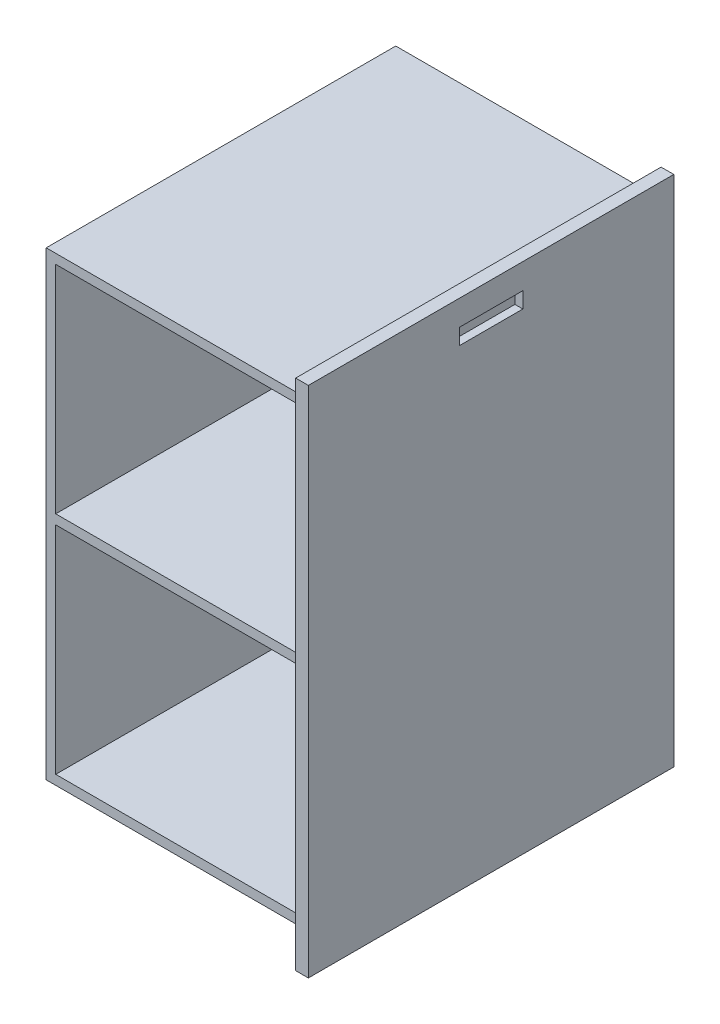
ISO-10303-21;
HEADER;
FILE_DESCRIPTION(('STEP AP214'),'2;1');
FILE_NAME('part.step','',(''),(''),'','','');
FILE_SCHEMA(('AUTOMOTIVE_DESIGN { 1 0 10303 214 1 1 1 1 }'));
ENDSEC;
DATA;
#1=APPLICATION_CONTEXT('core data for automotive mechanical design processes');
#2=APPLICATION_PROTOCOL_DEFINITION('international standard','automotive_design',2000,#1);
#3=PRODUCT_CONTEXT('',#1,'mechanical');
#4=PRODUCT('Part','Part','',(#3));
#5=PRODUCT_RELATED_PRODUCT_CATEGORY('part','',(#4));
#6=PRODUCT_DEFINITION_FORMATION('','',#4);
#7=PRODUCT_DEFINITION_CONTEXT('part definition',#1,'design');
#8=PRODUCT_DEFINITION('design','',#6,#7);
#9=PRODUCT_DEFINITION_SHAPE('','',#8);
#10=(LENGTH_UNIT() NAMED_UNIT(*) SI_UNIT(.MILLI.,.METRE.));
#11=(NAMED_UNIT(*) PLANE_ANGLE_UNIT() SI_UNIT($,.RADIAN.));
#12=(NAMED_UNIT(*) SI_UNIT($,.STERADIAN.) SOLID_ANGLE_UNIT());
#13=UNCERTAINTY_MEASURE_WITH_UNIT(LENGTH_MEASURE(1.E-05),#10,'distance_accuracy_value','');
#14=(GEOMETRIC_REPRESENTATION_CONTEXT(3) GLOBAL_UNCERTAINTY_ASSIGNED_CONTEXT((#13)) GLOBAL_UNIT_ASSIGNED_CONTEXT((#10,
#11,#12)) REPRESENTATION_CONTEXT('',''));
#15=CARTESIAN_POINT('',(0.,0.,0.));
#16=DIRECTION('',(0.,0.,1.));
#17=DIRECTION('',(1.,0.,0.));
#18=AXIS2_PLACEMENT_3D('',#15,#16,#17);
#19=CARTESIAN_POINT('',(0.,-353.06,558.8));
#20=DIRECTION('',(0.,-1.,0.));
#21=DIRECTION('',(1.,0.,0.));
#22=AXIS2_PLACEMENT_3D('',#19,#20,#21);
#23=PLANE('',#22);
#24=DIRECTION('',(-1.,0.,0.));
#25=VECTOR('',#24,1.);
#26=CARTESIAN_POINT('',(0.,-353.06,558.8));
#27=LINE('',#26,#25);
#28=CARTESIAN_POINT('',(195.58,-353.06,558.8));
#29=VERTEX_POINT('',#28);
#30=CARTESIAN_POINT('',(-200.66,-353.06,558.8));
#31=VERTEX_POINT('',#30);
#32=EDGE_CURVE('E348',#29,#31,#27,.T.);
#33=ORIENTED_EDGE('',*,*,#32,.F.);
#34=DIRECTION('',(0.,0.,-1.));
#35=VECTOR('',#34,1.);
#36=CARTESIAN_POINT('',(195.58,-353.06,558.8));
#37=LINE('',#36,#35);
#38=CARTESIAN_POINT('',(195.58,-353.06,0.));
#39=VERTEX_POINT('',#38);
#40=EDGE_CURVE('E301',#29,#39,#37,.T.);
#41=ORIENTED_EDGE('',*,*,#40,.T.);
#42=DIRECTION('',(-1.,0.,0.));
#43=VECTOR('',#42,1.);
#44=CARTESIAN_POINT('',(0.,-353.06,0.));
#45=LINE('',#44,#43);
#46=CARTESIAN_POINT('',(-200.66,-353.06,0.));
#47=VERTEX_POINT('',#46);
#48=EDGE_CURVE('E380',#39,#47,#45,.T.);
#49=ORIENTED_EDGE('',*,*,#48,.T.);
#50=DIRECTION('',(0.,0.,-1.));
#51=VECTOR('',#50,1.);
#52=CARTESIAN_POINT('',(-200.66,-353.06,558.8));
#53=LINE('',#52,#51);
#54=EDGE_CURVE('E390',#31,#47,#53,.T.);
#55=ORIENTED_EDGE('',*,*,#54,.F.);
#56=EDGE_LOOP('',(#33,#41,#49,#55));
#57=FACE_BOUND('',#56,.T.);
#58=ADVANCED_FACE('F51',(#57),#23,.F.);
#59=CARTESIAN_POINT('',(-200.66,0.,558.8));
#60=DIRECTION('',(-1.,0.,0.));
#61=DIRECTION('',(0.,0.,1.));
#62=AXIS2_PLACEMENT_3D('',#59,#60,#61);
#63=PLANE('',#62);
#64=DIRECTION('',(0.,1.,0.));
#65=VECTOR('',#64,1.);
#66=CARTESIAN_POINT('',(-200.66,0.,0.));
#67=LINE('',#66,#65);
#68=CARTESIAN_POINT('',(-200.66,-7.61999999999994,0.));
#69=VERTEX_POINT('',#68);
#70=EDGE_CURVE('E365',#47,#69,#67,.T.);
#71=ORIENTED_EDGE('',*,*,#70,.T.);
#72=DIRECTION('',(0.,0.,-1.));
#73=VECTOR('',#72,1.);
#74=CARTESIAN_POINT('',(-200.66,-7.61999999999994,558.8));
#75=LINE('',#74,#73);
#76=CARTESIAN_POINT('',(-200.66,-7.61999999999994,558.8));
#77=VERTEX_POINT('',#76);
#78=EDGE_CURVE('E386',#77,#69,#75,.T.);
#79=ORIENTED_EDGE('',*,*,#78,.F.);
#80=DIRECTION('',(0.,1.,0.));
#81=VECTOR('',#80,1.);
#82=CARTESIAN_POINT('',(-200.66,0.,558.8));
#83=LINE('',#82,#81);
#84=EDGE_CURVE('E333',#31,#77,#83,.T.);
#85=ORIENTED_EDGE('',*,*,#84,.F.);
#86=ORIENTED_EDGE('',*,*,#54,.T.);
#87=EDGE_LOOP('',(#71,#79,#85,#86));
#88=FACE_BOUND('',#87,.T.);
#89=ADVANCED_FACE('F451',(#88),#63,.F.);
#90=CARTESIAN_POINT('',(0.,-7.61999999999994,558.8));
#91=DIRECTION('',(0.,1.,0.));
#92=DIRECTION('',(-1.,0.,0.));
#93=AXIS2_PLACEMENT_3D('',#90,#91,#92);
#94=PLANE('',#93);
#95=DIRECTION('',(1.,0.,0.));
#96=VECTOR('',#95,1.);
#97=CARTESIAN_POINT('',(0.,-7.61999999999994,0.));
#98=LINE('',#97,#96);
#99=CARTESIAN_POINT('',(195.58,-7.61999999999994,0.));
#100=VERTEX_POINT('',#99);
#101=EDGE_CURVE('E328',#69,#100,#98,.T.);
#102=ORIENTED_EDGE('',*,*,#101,.T.);
#103=DIRECTION('',(0.,0.,1.));
#104=VECTOR('',#103,1.);
#105=CARTESIAN_POINT('',(195.58,-7.61999999999994,558.8));
#106=LINE('',#105,#104);
#107=CARTESIAN_POINT('',(195.58,-7.61999999999994,558.8));
#108=VERTEX_POINT('',#107);
#109=EDGE_CURVE('E313',#100,#108,#106,.T.);
#110=ORIENTED_EDGE('',*,*,#109,.T.);
#111=DIRECTION('',(1.,0.,0.));
#112=VECTOR('',#111,1.);
#113=CARTESIAN_POINT('',(0.,-7.61999999999994,558.8));
#114=LINE('',#113,#112);
#115=EDGE_CURVE('E351',#77,#108,#114,.T.);
#116=ORIENTED_EDGE('',*,*,#115,.F.);
#117=ORIENTED_EDGE('',*,*,#78,.T.);
#118=EDGE_LOOP('',(#102,#110,#116,#117));
#119=FACE_BOUND('',#118,.T.);
#120=ADVANCED_FACE('F441',(#119),#94,.F.);
#121=CARTESIAN_POINT('',(0.,-368.3,558.8));
#122=DIRECTION('',(0.,1.,0.));
#123=DIRECTION('',(0.,0.,1.));
#124=AXIS2_PLACEMENT_3D('',#121,#122,#123);
#125=PLANE('',#124);
#126=DIRECTION('',(1.,0.,0.));
#127=VECTOR('',#126,1.);
#128=CARTESIAN_POINT('',(0.,-368.3,0.));
#129=LINE('',#128,#127);
#130=CARTESIAN_POINT('',(-215.9,-368.3,0.));
#131=VERTEX_POINT('',#130);
#132=CARTESIAN_POINT('',(195.58,-368.3,0.));
#133=VERTEX_POINT('',#132);
#134=EDGE_CURVE('E368',#131,#133,#129,.T.);
#135=ORIENTED_EDGE('',*,*,#134,.T.);
#136=DIRECTION('',(0.,0.,1.));
#137=VECTOR('',#136,1.);
#138=CARTESIAN_POINT('',(195.58,-368.3,558.8));
#139=LINE('',#138,#137);
#140=CARTESIAN_POINT('',(195.58,-368.3,558.8));
#141=VERTEX_POINT('',#140);
#142=EDGE_CURVE('E289',#133,#141,#139,.T.);
#143=ORIENTED_EDGE('',*,*,#142,.T.);
#144=DIRECTION('',(1.,0.,0.));
#145=VECTOR('',#144,1.);
#146=CARTESIAN_POINT('',(0.,-368.3,558.8));
#147=LINE('',#146,#145);
#148=CARTESIAN_POINT('',(-215.9,-368.3,558.8));
#149=VERTEX_POINT('',#148);
#150=EDGE_CURVE('E336',#149,#141,#147,.T.);
#151=ORIENTED_EDGE('',*,*,#150,.F.);
#152=DIRECTION('',(0.,0.,-1.));
#153=VECTOR('',#152,1.);
#154=CARTESIAN_POINT('',(-215.9,-368.3,558.8));
#155=LINE('',#154,#153);
#156=EDGE_CURVE('E396',#149,#131,#155,.T.);
#157=ORIENTED_EDGE('',*,*,#156,.T.);
#158=EDGE_LOOP('',(#135,#143,#151,#157));
#159=FACE_BOUND('',#158,.T.);
#160=ADVANCED_FACE('F482',(#159),#125,.F.);
#161=CARTESIAN_POINT('',(0.,368.3,558.8));
#162=DIRECTION('',(0.,1.,0.));
#163=DIRECTION('',(0.,0.,1.));
#164=AXIS2_PLACEMENT_3D('',#161,#162,#163);
#165=PLANE('',#164);
#166=DIRECTION('',(0.,0.,1.));
#167=VECTOR('',#166,1.);
#168=CARTESIAN_POINT('',(195.58,368.3,558.8));
#169=LINE('',#168,#167);
#170=CARTESIAN_POINT('',(195.58,368.3,0.));
#171=VERTEX_POINT('',#170);
#172=CARTESIAN_POINT('',(195.58,368.3,558.8));
#173=VERTEX_POINT('',#172);
#174=EDGE_CURVE('E320',#171,#173,#169,.T.);
#175=ORIENTED_EDGE('',*,*,#174,.F.);
#176=DIRECTION('',(1.,0.,0.));
#177=VECTOR('',#176,1.);
#178=CARTESIAN_POINT('',(0.,368.3,0.));
#179=LINE('',#178,#177);
#180=CARTESIAN_POINT('',(-215.9,368.3,0.));
#181=VERTEX_POINT('',#180);
#182=EDGE_CURVE('E372',#181,#171,#179,.T.);
#183=ORIENTED_EDGE('',*,*,#182,.F.);
#184=DIRECTION('',(0.,0.,-1.));
#185=VECTOR('',#184,1.);
#186=CARTESIAN_POINT('',(-215.9,368.3,558.8));
#187=LINE('',#186,#185);
#188=CARTESIAN_POINT('',(-215.9,368.3,558.8));
#189=VERTEX_POINT('',#188);
#190=EDGE_CURVE('E391',#189,#181,#187,.T.);
#191=ORIENTED_EDGE('',*,*,#190,.F.);
#192=DIRECTION('',(1.,0.,0.));
#193=VECTOR('',#192,1.);
#194=CARTESIAN_POINT('',(0.,368.3,558.8));
#195=LINE('',#194,#193);
#196=EDGE_CURVE('E340',#189,#173,#195,.T.);
#197=ORIENTED_EDGE('',*,*,#196,.T.);
#198=EDGE_LOOP('',(#175,#183,#191,#197));
#199=FACE_BOUND('',#198,.T.);
#200=ADVANCED_FACE('F475',(#199),#165,.T.);
#201=CARTESIAN_POINT('',(0.,7.62000000000005,558.8));
#202=DIRECTION('',(0.,1.,0.));
#203=DIRECTION('',(0.,0.,1.));
#204=AXIS2_PLACEMENT_3D('',#201,#202,#203);
#205=PLANE('',#204);
#206=DIRECTION('',(0.,0.,1.));
#207=VECTOR('',#206,1.);
#208=CARTESIAN_POINT('',(195.58,7.62000000000005,558.8));
#209=LINE('',#208,#207);
#210=CARTESIAN_POINT('',(195.58,7.62000000000005,0.));
#211=VERTEX_POINT('',#210);
#212=CARTESIAN_POINT('',(195.58,7.62000000000005,558.8));
#213=VERTEX_POINT('',#212);
#214=EDGE_CURVE('E308',#211,#213,#209,.T.);
#215=ORIENTED_EDGE('',*,*,#214,.F.);
#216=DIRECTION('',(1.,0.,0.));
#217=VECTOR('',#216,1.);
#218=CARTESIAN_POINT('',(0.,7.62000000000005,0.));
#219=LINE('',#218,#217);
#220=CARTESIAN_POINT('',(-200.66,7.62000000000005,0.));
#221=VERTEX_POINT('',#220);
#222=EDGE_CURVE('E356',#221,#211,#219,.T.);
#223=ORIENTED_EDGE('',*,*,#222,.F.);
#224=DIRECTION('',(0.,0.,-1.));
#225=VECTOR('',#224,1.);
#226=CARTESIAN_POINT('',(-200.66,7.62000000000005,558.8));
#227=LINE('',#226,#225);
#228=CARTESIAN_POINT('',(-200.66,7.62000000000005,558.8));
#229=VERTEX_POINT('',#228);
#230=EDGE_CURVE('E399',#229,#221,#227,.T.);
#231=ORIENTED_EDGE('',*,*,#230,.F.);
#232=DIRECTION('',(1.,0.,0.));
#233=VECTOR('',#232,1.);
#234=CARTESIAN_POINT('',(0.,7.62000000000005,558.8));
#235=LINE('',#234,#233);
#236=EDGE_CURVE('E323',#229,#213,#235,.T.);
#237=ORIENTED_EDGE('',*,*,#236,.T.);
#238=EDGE_LOOP('',(#215,#223,#231,#237));
#239=FACE_BOUND('',#238,.T.);
#240=ADVANCED_FACE('F459',(#239),#205,.T.);
#241=CARTESIAN_POINT('',(-200.66,353.06,0.));
#242=VERTEX_POINT('',#241);
#243=EDGE_CURVE('E360',#221,#242,#67,.T.);
#244=ORIENTED_EDGE('',*,*,#243,.T.);
#245=DIRECTION('',(0.,0.,-1.));
#246=VECTOR('',#245,1.);
#247=CARTESIAN_POINT('',(-200.66,353.06,558.8));
#248=LINE('',#247,#246);
#249=CARTESIAN_POINT('',(-200.66,353.06,558.8));
#250=VERTEX_POINT('',#249);
#251=EDGE_CURVE('E355',#250,#242,#248,.T.);
#252=ORIENTED_EDGE('',*,*,#251,.F.);
#253=EDGE_CURVE('E327',#229,#250,#83,.T.);
#254=ORIENTED_EDGE('',*,*,#253,.F.);
#255=ORIENTED_EDGE('',*,*,#230,.T.);
#256=EDGE_LOOP('',(#244,#252,#254,#255));
#257=FACE_BOUND('',#256,.T.);
#258=ADVANCED_FACE('F464',(#257),#63,.F.);
#259=CARTESIAN_POINT('',(0.,353.06,558.8));
#260=DIRECTION('',(0.,-1.,0.));
#261=DIRECTION('',(1.,0.,0.));
#262=AXIS2_PLACEMENT_3D('',#259,#260,#261);
#263=PLANE('',#262);
#264=DIRECTION('',(0.,0.,-1.));
#265=VECTOR('',#264,1.);
#266=CARTESIAN_POINT('',(195.58,353.06,558.8));
#267=LINE('',#266,#265);
#268=CARTESIAN_POINT('',(195.58,353.06,558.8));
#269=VERTEX_POINT('',#268);
#270=CARTESIAN_POINT('',(195.58,353.06,0.));
#271=VERTEX_POINT('',#270);
#272=EDGE_CURVE('E317',#269,#271,#267,.T.);
#273=ORIENTED_EDGE('',*,*,#272,.F.);
#274=DIRECTION('',(-1.,0.,0.));
#275=VECTOR('',#274,1.);
#276=CARTESIAN_POINT('',(0.,353.06,558.8));
#277=LINE('',#276,#275);
#278=EDGE_CURVE('E332',#269,#250,#277,.T.);
#279=ORIENTED_EDGE('',*,*,#278,.T.);
#280=ORIENTED_EDGE('',*,*,#251,.T.);
#281=DIRECTION('',(-1.,0.,0.));
#282=VECTOR('',#281,1.);
#283=CARTESIAN_POINT('',(0.,353.06,0.));
#284=LINE('',#283,#282);
#285=EDGE_CURVE('E364',#271,#242,#284,.T.);
#286=ORIENTED_EDGE('',*,*,#285,.F.);
#287=EDGE_LOOP('',(#273,#279,#280,#286));
#288=FACE_BOUND('',#287,.T.);
#289=ADVANCED_FACE('F468',(#288),#263,.T.);
#290=CARTESIAN_POINT('',(-215.9,0.,558.8));
#291=DIRECTION('',(-1.,0.,0.));
#292=DIRECTION('',(0.,0.,1.));
#293=AXIS2_PLACEMENT_3D('',#290,#291,#292);
#294=PLANE('',#293);
#295=CARTESIAN_POINT('',(-215.9,315.976,421.619832518451));
#296=DIRECTION('',(-1.,0.,0.));
#297=DIRECTION('',(0.,0.,1.));
#298=AXIS2_PLACEMENT_3D('',#295,#296,#297);
#299=CIRCLE('',#298,2.54000000000001);
#300=CARTESIAN_POINT('',(-215.9,315.976,424.159832518451));
#301=VERTEX_POINT('',#300);
#302=EDGE_CURVE('E951',#301,#301,#299,.T.);
#303=ORIENTED_EDGE('',*,*,#302,.F.);
#304=EDGE_LOOP('',(#303));
#305=FACE_BOUND('',#304,.T.);
#306=CARTESIAN_POINT('',(-215.9,330.962,401.553832518451));
#307=DIRECTION('',(-1.,0.,0.));
#308=DIRECTION('',(0.,0.,1.));
#309=AXIS2_PLACEMENT_3D('',#306,#307,#308);
#310=CIRCLE('',#309,2.54000000000001);
#311=CARTESIAN_POINT('',(-215.9,330.962,404.093832518451));
#312=VERTEX_POINT('',#311);
#313=EDGE_CURVE('E993',#312,#312,#310,.T.);
#314=ORIENTED_EDGE('',*,*,#313,.F.);
#315=EDGE_LOOP('',(#314));
#316=FACE_BOUND('',#315,.T.);
#317=CARTESIAN_POINT('',(-215.9,330.962,441.685832518451));
#318=DIRECTION('',(-1.,0.,0.));
#319=DIRECTION('',(0.,0.,1.));
#320=AXIS2_PLACEMENT_3D('',#317,#318,#319);
#321=CIRCLE('',#320,2.54000000000001);
#322=CARTESIAN_POINT('',(-215.9,330.962,444.225832518451));
#323=VERTEX_POINT('',#322);
#324=EDGE_CURVE('E985',#323,#323,#321,.T.);
#325=ORIENTED_EDGE('',*,*,#324,.F.);
#326=EDGE_LOOP('',(#325));
#327=FACE_BOUND('',#326,.T.);
#328=CARTESIAN_POINT('',(-215.9,330.962,117.114167481549));
#329=DIRECTION('',(-1.,0.,0.));
#330=DIRECTION('',(0.,0.,-1.));
#331=AXIS2_PLACEMENT_3D('',#328,#329,#330);
#332=CIRCLE('',#331,2.54000000000001);
#333=CARTESIAN_POINT('',(-215.9,330.962,114.574167481549));
#334=VERTEX_POINT('',#333);
#335=EDGE_CURVE('E975',#334,#334,#332,.T.);
#336=ORIENTED_EDGE('',*,*,#335,.F.);
#337=EDGE_LOOP('',(#336));
#338=FACE_BOUND('',#337,.T.);
#339=CARTESIAN_POINT('',(-215.9,330.962,157.246167481549));
#340=DIRECTION('',(-1.,0.,0.));
#341=DIRECTION('',(0.,0.,-1.));
#342=AXIS2_PLACEMENT_3D('',#339,#340,#341);
#343=CIRCLE('',#342,2.54000000000001);
#344=CARTESIAN_POINT('',(-215.9,330.962,154.706167481549));
#345=VERTEX_POINT('',#344);
#346=EDGE_CURVE('E964',#345,#345,#343,.T.);
#347=ORIENTED_EDGE('',*,*,#346,.F.);
#348=EDGE_LOOP('',(#347));
#349=FACE_BOUND('',#348,.T.);
#350=CARTESIAN_POINT('',(-215.9,315.976,137.180167481549));
#351=DIRECTION('',(-1.,0.,0.));
#352=DIRECTION('',(0.,0.,-1.));
#353=AXIS2_PLACEMENT_3D('',#350,#351,#352);
#354=CIRCLE('',#353,2.54000000000001);
#355=CARTESIAN_POINT('',(-215.9,315.976,134.640167481549));
#356=VERTEX_POINT('',#355);
#357=EDGE_CURVE('E961',#356,#356,#354,.T.);
#358=ORIENTED_EDGE('',*,*,#357,.F.);
#359=EDGE_LOOP('',(#358));
#360=FACE_BOUND('',#359,.T.);
#361=DIRECTION('',(0.,1.,0.));
#362=VECTOR('',#361,1.);
#363=CARTESIAN_POINT('',(-215.9,0.,0.));
#364=LINE('',#363,#362);
#365=EDGE_CURVE('E376',#131,#181,#364,.T.);
#366=ORIENTED_EDGE('',*,*,#365,.F.);
#367=ORIENTED_EDGE('',*,*,#156,.F.);
#368=DIRECTION('',(0.,1.,0.));
#369=VECTOR('',#368,1.);
#370=CARTESIAN_POINT('',(-215.9,0.,558.8));
#371=LINE('',#370,#369);
#372=EDGE_CURVE('E344',#149,#189,#371,.T.);
#373=ORIENTED_EDGE('',*,*,#372,.T.);
#374=ORIENTED_EDGE('',*,*,#190,.T.);
#375=EDGE_LOOP('',(#366,#367,#373,#374));
#376=FACE_BOUND('',#375,.T.);
#377=ADVANCED_FACE('F479',(#305,#316,#327,#338,#349,#360,#376),#294,.T.);
#378=CARTESIAN_POINT('',(0.,0.,558.8));
#379=DIRECTION('',(0.,0.,1.));
#380=DIRECTION('',(1.,0.,0.));
#381=AXIS2_PLACEMENT_3D('',#378,#379,#380);
#382=PLANE('',#381);
#383=DIRECTION('',(0.,-1.,0.));
#384=VECTOR('',#383,1.);
#385=CARTESIAN_POINT('',(195.58,0.,558.8));
#386=LINE('',#385,#384);
#387=EDGE_CURVE('E309',#173,#269,#386,.T.);
#388=ORIENTED_EDGE('',*,*,#387,.F.);
#389=ORIENTED_EDGE('',*,*,#196,.F.);
#390=ORIENTED_EDGE('',*,*,#372,.F.);
#391=ORIENTED_EDGE('',*,*,#150,.T.);
#392=EDGE_CURVE('E305',#29,#141,#386,.T.);
#393=ORIENTED_EDGE('',*,*,#392,.F.);
#394=ORIENTED_EDGE('',*,*,#32,.T.);
#395=ORIENTED_EDGE('',*,*,#84,.T.);
#396=ORIENTED_EDGE('',*,*,#115,.T.);
#397=EDGE_CURVE('E310',#213,#108,#386,.T.);
#398=ORIENTED_EDGE('',*,*,#397,.F.);
#399=ORIENTED_EDGE('',*,*,#236,.F.);
#400=ORIENTED_EDGE('',*,*,#253,.T.);
#401=ORIENTED_EDGE('',*,*,#278,.F.);
#402=EDGE_LOOP('',(#388,#389,#390,#391,#393,#394,#395,#396,#398,#399,#400,#401));
#403=FACE_BOUND('',#402,.T.);
#404=ADVANCED_FACE('F444',(#403),#382,.T.);
#405=CARTESIAN_POINT('',(0.,0.,0.));
#406=DIRECTION('',(0.,0.,1.));
#407=DIRECTION('',(1.,0.,0.));
#408=AXIS2_PLACEMENT_3D('',#405,#406,#407);
#409=PLANE('',#408);
#410=ORIENTED_EDGE('',*,*,#182,.T.);
#411=DIRECTION('',(0.,-1.,0.));
#412=VECTOR('',#411,1.);
#413=CARTESIAN_POINT('',(195.58,0.,0.));
#414=LINE('',#413,#412);
#415=EDGE_CURVE('E411',#171,#271,#414,.T.);
#416=ORIENTED_EDGE('',*,*,#415,.T.);
#417=ORIENTED_EDGE('',*,*,#285,.T.);
#418=ORIENTED_EDGE('',*,*,#243,.F.);
#419=ORIENTED_EDGE('',*,*,#222,.T.);
#420=EDGE_CURVE('E410',#211,#100,#414,.T.);
#421=ORIENTED_EDGE('',*,*,#420,.T.);
#422=ORIENTED_EDGE('',*,*,#101,.F.);
#423=ORIENTED_EDGE('',*,*,#70,.F.);
#424=ORIENTED_EDGE('',*,*,#48,.F.);
#425=EDGE_CURVE('E395',#39,#133,#414,.T.);
#426=ORIENTED_EDGE('',*,*,#425,.T.);
#427=ORIENTED_EDGE('',*,*,#134,.F.);
#428=ORIENTED_EDGE('',*,*,#365,.T.);
#429=EDGE_LOOP('',(#410,#416,#417,#418,#419,#421,#422,#423,#424,#426,#427,#428));
#430=FACE_BOUND('',#429,.T.);
#431=ADVANCED_FACE('F454',(#430),#409,.F.);
#432=CARTESIAN_POINT('',(195.58,-420.37,-12.6999999999999));
#433=DIRECTION('',(0.,0.,-1.));
#434=DIRECTION('',(0.,1.,0.));
#435=AXIS2_PLACEMENT_3D('',#432,#433,#434);
#436=PLANE('',#435);
#437=DIRECTION('',(0.,1.,0.));
#438=VECTOR('',#437,1.);
#439=CARTESIAN_POINT('',(215.9,-420.37,-12.6999999999999));
#440=LINE('',#439,#438);
#441=CARTESIAN_POINT('',(215.9,-420.37,-12.6999999999999));
#442=VERTEX_POINT('',#441);
#443=CARTESIAN_POINT('',(215.9,400.05,-12.6999999999998));
#444=VERTEX_POINT('',#443);
#445=EDGE_CURVE('E251',#442,#444,#440,.T.);
#446=ORIENTED_EDGE('',*,*,#445,.F.);
#447=DIRECTION('',(1.,0.,0.));
#448=VECTOR('',#447,1.);
#449=CARTESIAN_POINT('',(195.58,-420.37,-12.6999999999999));
#450=LINE('',#449,#448);
#451=CARTESIAN_POINT('',(195.58,-420.37,-12.6999999999999));
#452=VERTEX_POINT('',#451);
#453=EDGE_CURVE('E286',#452,#442,#450,.T.);
#454=ORIENTED_EDGE('',*,*,#453,.F.);
#455=DIRECTION('',(0.,1.,0.));
#456=VECTOR('',#455,1.);
#457=CARTESIAN_POINT('',(195.58,-420.37,-12.6999999999999));
#458=LINE('',#457,#456);
#459=CARTESIAN_POINT('',(195.58,400.05,-12.6999999999998));
#460=VERTEX_POINT('',#459);
#461=EDGE_CURVE('E254',#452,#460,#458,.T.);
#462=ORIENTED_EDGE('',*,*,#461,.T.);
#463=DIRECTION('',(1.,0.,0.));
#464=VECTOR('',#463,1.);
#465=CARTESIAN_POINT('',(195.58,400.05,-12.6999999999998));
#466=LINE('',#465,#464);
#467=EDGE_CURVE('E271',#460,#444,#466,.T.);
#468=ORIENTED_EDGE('',*,*,#467,.T.);
#469=EDGE_LOOP('',(#446,#454,#462,#468));
#470=FACE_BOUND('',#469,.T.);
#471=ADVANCED_FACE('F503',(#470),#436,.T.);
#472=CARTESIAN_POINT('',(195.58,-420.37,571.5));
#473=DIRECTION('',(0.,-1.,0.));
#474=DIRECTION('',(0.,0.,-1.));
#475=AXIS2_PLACEMENT_3D('',#472,#473,#474);
#476=PLANE('',#475);
#477=DIRECTION('',(0.,0.,-1.));
#478=VECTOR('',#477,1.);
#479=CARTESIAN_POINT('',(215.9,-420.37,571.5));
#480=LINE('',#479,#478);
#481=CARTESIAN_POINT('',(215.9,-420.37,571.5));
#482=VERTEX_POINT('',#481);
#483=EDGE_CURVE('E259',#482,#442,#480,.T.);
#484=ORIENTED_EDGE('',*,*,#483,.F.);
#485=DIRECTION('',(1.,0.,0.));
#486=VECTOR('',#485,1.);
#487=CARTESIAN_POINT('',(195.58,-420.37,571.5));
#488=LINE('',#487,#486);
#489=CARTESIAN_POINT('',(195.58,-420.37,571.5));
#490=VERTEX_POINT('',#489);
#491=EDGE_CURVE('E290',#490,#482,#488,.T.);
#492=ORIENTED_EDGE('',*,*,#491,.F.);
#493=DIRECTION('',(0.,0.,-1.));
#494=VECTOR('',#493,1.);
#495=CARTESIAN_POINT('',(195.58,-420.37,571.5));
#496=LINE('',#495,#494);
#497=EDGE_CURVE('E267',#490,#452,#496,.T.);
#498=ORIENTED_EDGE('',*,*,#497,.T.);
#499=ORIENTED_EDGE('',*,*,#453,.T.);
#500=EDGE_LOOP('',(#484,#492,#498,#499));
#501=FACE_BOUND('',#500,.T.);
#502=ADVANCED_FACE('F496',(#501),#476,.T.);
#503=CARTESIAN_POINT('',(195.58,-420.37,571.5));
#504=DIRECTION('',(0.,0.,1.));
#505=DIRECTION('',(0.,-1.,0.));
#506=AXIS2_PLACEMENT_3D('',#503,#504,#505);
#507=PLANE('',#506);
#508=DIRECTION('',(0.,-1.,0.));
#509=VECTOR('',#508,1.);
#510=CARTESIAN_POINT('',(215.9,-420.37,571.5));
#511=LINE('',#510,#509);
#512=CARTESIAN_POINT('',(215.9,400.05,571.5));
#513=VERTEX_POINT('',#512);
#514=EDGE_CURVE('E279',#513,#482,#511,.T.);
#515=ORIENTED_EDGE('',*,*,#514,.F.);
#516=DIRECTION('',(1.,0.,0.));
#517=VECTOR('',#516,1.);
#518=CARTESIAN_POINT('',(195.58,400.05,571.5));
#519=LINE('',#518,#517);
#520=CARTESIAN_POINT('',(195.58,400.05,571.5));
#521=VERTEX_POINT('',#520);
#522=EDGE_CURVE('E293',#521,#513,#519,.T.);
#523=ORIENTED_EDGE('',*,*,#522,.F.);
#524=DIRECTION('',(0.,-1.,0.));
#525=VECTOR('',#524,1.);
#526=CARTESIAN_POINT('',(195.58,-420.37,571.5));
#527=LINE('',#526,#525);
#528=EDGE_CURVE('E263',#521,#490,#527,.T.);
#529=ORIENTED_EDGE('',*,*,#528,.T.);
#530=ORIENTED_EDGE('',*,*,#491,.T.);
#531=EDGE_LOOP('',(#515,#523,#529,#530));
#532=FACE_BOUND('',#531,.T.);
#533=ADVANCED_FACE('F500',(#532),#507,.T.);
#534=CARTESIAN_POINT('',(195.58,400.05,571.5));
#535=DIRECTION('',(0.,1.,0.));
#536=DIRECTION('',(0.,0.,1.));
#537=AXIS2_PLACEMENT_3D('',#534,#535,#536);
#538=PLANE('',#537);
#539=DIRECTION('',(0.,0.,1.));
#540=VECTOR('',#539,1.);
#541=CARTESIAN_POINT('',(215.9,400.05,571.5));
#542=LINE('',#541,#540);
#543=EDGE_CURVE('E275',#444,#513,#542,.T.);
#544=ORIENTED_EDGE('',*,*,#543,.F.);
#545=ORIENTED_EDGE('',*,*,#467,.F.);
#546=DIRECTION('',(0.,0.,1.));
#547=VECTOR('',#546,1.);
#548=CARTESIAN_POINT('',(195.58,400.05,571.5));
#549=LINE('',#548,#547);
#550=EDGE_CURVE('E258',#460,#521,#549,.T.);
#551=ORIENTED_EDGE('',*,*,#550,.T.);
#552=ORIENTED_EDGE('',*,*,#522,.T.);
#553=EDGE_LOOP('',(#544,#545,#551,#552));
#554=FACE_BOUND('',#553,.T.);
#555=ADVANCED_FACE('F487',(#554),#538,.T.);
#556=CARTESIAN_POINT('',(195.58,0.,0.));
#557=DIRECTION('',(-1.,0.,0.));
#558=DIRECTION('',(0.,0.,1.));
#559=AXIS2_PLACEMENT_3D('',#556,#557,#558);
#560=PLANE('',#559);
#561=ORIENTED_EDGE('',*,*,#174,.T.);
#562=ORIENTED_EDGE('',*,*,#387,.T.);
#563=ORIENTED_EDGE('',*,*,#272,.T.);
#564=ORIENTED_EDGE('',*,*,#415,.F.);
#565=EDGE_LOOP('',(#561,#562,#563,#564));
#566=FACE_BOUND('',#565,.T.);
#567=ORIENTED_EDGE('',*,*,#214,.T.);
#568=ORIENTED_EDGE('',*,*,#397,.T.);
#569=ORIENTED_EDGE('',*,*,#109,.F.);
#570=ORIENTED_EDGE('',*,*,#420,.F.);
#571=EDGE_LOOP('',(#567,#568,#569,#570));
#572=FACE_BOUND('',#571,.T.);
#573=ORIENTED_EDGE('',*,*,#40,.F.);
#574=ORIENTED_EDGE('',*,*,#392,.T.);
#575=ORIENTED_EDGE('',*,*,#142,.F.);
#576=ORIENTED_EDGE('',*,*,#425,.F.);
#577=EDGE_LOOP('',(#573,#574,#575,#576));
#578=FACE_BOUND('',#577,.T.);
#579=ORIENTED_EDGE('',*,*,#461,.F.);
#580=ORIENTED_EDGE('',*,*,#497,.F.);
#581=ORIENTED_EDGE('',*,*,#528,.F.);
#582=ORIENTED_EDGE('',*,*,#550,.F.);
#583=EDGE_LOOP('',(#579,#580,#581,#582));
#584=FACE_BOUND('',#583,.T.);
#585=ADVANCED_FACE('F434',(#566,#572,#578,#584),#560,.T.);
#586=CARTESIAN_POINT('',(215.9,0.,558.8));
#587=DIRECTION('',(-1.,0.,0.));
#588=DIRECTION('',(0.,0.,1.));
#589=AXIS2_PLACEMENT_3D('',#586,#587,#588);
#590=PLANE('',#589);
#591=DIRECTION('',(0.,0.,1.));
#592=VECTOR('',#591,1.);
#593=CARTESIAN_POINT('',(215.9,359.787877014418,330.2));
#594=LINE('',#593,#592);
#595=CARTESIAN_POINT('',(215.9,359.787877014418,228.6));
#596=VERTEX_POINT('',#595);
#597=CARTESIAN_POINT('',(215.9,359.787877014418,330.2));
#598=VERTEX_POINT('',#597);
#599=EDGE_CURVE('E238',#596,#598,#594,.T.);
#600=ORIENTED_EDGE('',*,*,#599,.F.);
#601=DIRECTION('',(0.,1.,0.));
#602=VECTOR('',#601,1.);
#603=CARTESIAN_POINT('',(215.9,334.387877014419,228.6));
#604=LINE('',#603,#602);
#605=CARTESIAN_POINT('',(215.9,334.387877014419,228.6));
#606=VERTEX_POINT('',#605);
#607=EDGE_CURVE('E226',#606,#596,#604,.T.);
#608=ORIENTED_EDGE('',*,*,#607,.F.);
#609=DIRECTION('',(0.,0.,-1.));
#610=VECTOR('',#609,1.);
#611=CARTESIAN_POINT('',(215.9,334.387877014419,330.2));
#612=LINE('',#611,#610);
#613=CARTESIAN_POINT('',(215.9,334.387877014419,330.2));
#614=VERTEX_POINT('',#613);
#615=EDGE_CURVE('E231',#614,#606,#612,.T.);
#616=ORIENTED_EDGE('',*,*,#615,.F.);
#617=DIRECTION('',(0.,-1.,0.));
#618=VECTOR('',#617,1.);
#619=CARTESIAN_POINT('',(215.9,334.387877014419,330.2));
#620=LINE('',#619,#618);
#621=EDGE_CURVE('E242',#598,#614,#620,.T.);
#622=ORIENTED_EDGE('',*,*,#621,.F.);
#623=EDGE_LOOP('',(#600,#608,#616,#622));
#624=FACE_BOUND('',#623,.T.);
#625=ORIENTED_EDGE('',*,*,#445,.T.);
#626=ORIENTED_EDGE('',*,*,#543,.T.);
#627=ORIENTED_EDGE('',*,*,#514,.T.);
#628=ORIENTED_EDGE('',*,*,#483,.T.);
#629=EDGE_LOOP('',(#625,#626,#627,#628));
#630=FACE_BOUND('',#629,.T.);
#631=ADVANCED_FACE('F486',(#624,#630),#590,.F.);
#632=CARTESIAN_POINT('',(203.2,334.387877014419,228.6));
#633=DIRECTION('',(0.,0.,-1.));
#634=DIRECTION('',(-1.,0.,0.));
#635=AXIS2_PLACEMENT_3D('',#632,#633,#634);
#636=PLANE('',#635);
#637=CARTESIAN_POINT('',(219.031045912476,366.559003323532,228.6));
#638=DIRECTION('',(0.,0.,-1.));
#639=DIRECTION('',(-1.,0.,0.));
#640=AXIS2_PLACEMENT_3D('',#637,#638,#639);
#641=CIRCLE('',#640,7.46);
#642=CARTESIAN_POINT('',(211.678494291994,365.297423096933,228.6));
#643=VERTEX_POINT('',#642);
#644=EDGE_CURVE('E412',#596,#643,#641,.T.);
#645=ORIENTED_EDGE('',*,*,#644,.T.);
#646=CARTESIAN_POINT('',(209.175078592795,364.867877014419,228.6));
#647=DIRECTION('',(0.,0.,-1.));
#648=DIRECTION('',(-1.,0.,0.));
#649=AXIS2_PLACEMENT_3D('',#646,#647,#648);
#650=CIRCLE('',#649,2.54);
#651=CARTESIAN_POINT('',(209.175078592795,367.407877014418,228.6));
#652=VERTEX_POINT('',#651);
#653=EDGE_CURVE('E74',#643,#652,#650,.F.);
#654=ORIENTED_EDGE('',*,*,#653,.T.);
#655=DIRECTION('',(1.,0.,0.));
#656=VECTOR('',#655,1.);
#657=CARTESIAN_POINT('',(0.,367.407877014418,228.6));
#658=LINE('',#657,#656);
#659=CARTESIAN_POINT('',(203.2,367.407877014418,228.6));
#660=VERTEX_POINT('',#659);
#661=EDGE_CURVE('E223',#660,#652,#658,.T.);
#662=ORIENTED_EDGE('',*,*,#661,.F.);
#663=DIRECTION('',(0.,1.,0.));
#664=VECTOR('',#663,1.);
#665=CARTESIAN_POINT('',(203.2,334.387877014419,228.6));
#666=LINE('',#665,#664);
#667=CARTESIAN_POINT('',(203.2,334.387877014419,228.6));
#668=VERTEX_POINT('',#667);
#669=EDGE_CURVE('E218',#668,#660,#666,.T.);
#670=ORIENTED_EDGE('',*,*,#669,.F.);
#671=DIRECTION('',(1.,0.,0.));
#672=VECTOR('',#671,1.);
#673=CARTESIAN_POINT('',(203.2,334.387877014419,228.6));
#674=LINE('',#673,#672);
#675=EDGE_CURVE('E248',#668,#606,#674,.T.);
#676=ORIENTED_EDGE('',*,*,#675,.T.);
#677=ORIENTED_EDGE('',*,*,#607,.T.);
#678=EDGE_LOOP('',(#645,#654,#662,#670,#676,#677));
#679=FACE_BOUND('',#678,.T.);
#680=ADVANCED_FACE('F506',(#679),#636,.F.);
#681=CARTESIAN_POINT('',(203.2,334.387877014419,330.2));
#682=DIRECTION('',(0.,-1.,0.));
#683=DIRECTION('',(0.,0.,-1.));
#684=AXIS2_PLACEMENT_3D('',#681,#682,#683);
#685=PLANE('',#684);
#686=ORIENTED_EDGE('',*,*,#615,.T.);
#687=ORIENTED_EDGE('',*,*,#675,.F.);
#688=DIRECTION('',(0.,0.,-1.));
#689=VECTOR('',#688,1.);
#690=CARTESIAN_POINT('',(203.2,334.387877014419,330.2));
#691=LINE('',#690,#689);
#692=CARTESIAN_POINT('',(203.2,334.387877014419,330.2));
#693=VERTEX_POINT('',#692);
#694=EDGE_CURVE('E217',#693,#668,#691,.T.);
#695=ORIENTED_EDGE('',*,*,#694,.F.);
#696=DIRECTION('',(1.,0.,0.));
#697=VECTOR('',#696,1.);
#698=CARTESIAN_POINT('',(203.2,334.387877014419,330.2));
#699=LINE('',#698,#697);
#700=EDGE_CURVE('E212',#693,#614,#699,.T.);
#701=ORIENTED_EDGE('',*,*,#700,.T.);
#702=EDGE_LOOP('',(#686,#687,#695,#701));
#703=FACE_BOUND('',#702,.T.);
#704=ADVANCED_FACE('F512',(#703),#685,.F.);
#705=CARTESIAN_POINT('',(203.2,334.387877014419,330.2));
#706=DIRECTION('',(0.,0.,1.));
#707=DIRECTION('',(1.,0.,0.));
#708=AXIS2_PLACEMENT_3D('',#705,#706,#707);
#709=PLANE('',#708);
#710=DIRECTION('',(-1.,0.,0.));
#711=VECTOR('',#710,1.);
#712=CARTESIAN_POINT('',(0.,367.407877014418,330.2));
#713=LINE('',#712,#711);
#714=CARTESIAN_POINT('',(209.175078592795,367.407877014418,330.2));
#715=VERTEX_POINT('',#714);
#716=CARTESIAN_POINT('',(203.2,367.407877014418,330.2));
#717=VERTEX_POINT('',#716);
#718=EDGE_CURVE('E198',#715,#717,#713,.T.);
#719=ORIENTED_EDGE('',*,*,#718,.F.);
#720=CARTESIAN_POINT('',(209.175078592795,364.867877014419,330.2));
#721=DIRECTION('',(0.,0.,1.));
#722=DIRECTION('',(1.,0.,0.));
#723=AXIS2_PLACEMENT_3D('',#720,#721,#722);
#724=CIRCLE('',#723,2.54);
#725=CARTESIAN_POINT('',(211.678494291994,365.297423096933,330.2));
#726=VERTEX_POINT('',#725);
#727=EDGE_CURVE('E11',#715,#726,#724,.F.);
#728=ORIENTED_EDGE('',*,*,#727,.T.);
#729=CARTESIAN_POINT('',(219.031045912476,366.559003323532,330.2));
#730=DIRECTION('',(0.,0.,1.));
#731=DIRECTION('',(1.,0.,0.));
#732=AXIS2_PLACEMENT_3D('',#729,#730,#731);
#733=CIRCLE('',#732,7.46);
#734=EDGE_CURVE('E415',#726,#598,#733,.T.);
#735=ORIENTED_EDGE('',*,*,#734,.T.);
#736=ORIENTED_EDGE('',*,*,#621,.T.);
#737=ORIENTED_EDGE('',*,*,#700,.F.);
#738=DIRECTION('',(0.,-1.,0.));
#739=VECTOR('',#738,1.);
#740=CARTESIAN_POINT('',(203.2,334.387877014419,330.2));
#741=LINE('',#740,#739);
#742=EDGE_CURVE('E209',#717,#693,#741,.T.);
#743=ORIENTED_EDGE('',*,*,#742,.F.);
#744=EDGE_LOOP('',(#719,#728,#735,#736,#737,#743));
#745=FACE_BOUND('',#744,.T.);
#746=ADVANCED_FACE('F210',(#745),#709,.F.);
#747=CARTESIAN_POINT('',(203.2,0.,0.));
#748=DIRECTION('',(-1.,0.,0.));
#749=DIRECTION('',(0.,0.,1.));
#750=AXIS2_PLACEMENT_3D('',#747,#748,#749);
#751=PLANE('',#750);
#752=ORIENTED_EDGE('',*,*,#669,.T.);
#753=DIRECTION('',(0.,0.,-1.));
#754=VECTOR('',#753,1.);
#755=CARTESIAN_POINT('',(203.2,367.407877014418,0.));
#756=LINE('',#755,#754);
#757=EDGE_CURVE('E202',#717,#660,#756,.T.);
#758=ORIENTED_EDGE('',*,*,#757,.F.);
#759=ORIENTED_EDGE('',*,*,#742,.T.);
#760=ORIENTED_EDGE('',*,*,#694,.T.);
#761=EDGE_LOOP('',(#752,#758,#759,#760));
#762=FACE_BOUND('',#761,.T.);
#763=ADVANCED_FACE('F220',(#762),#751,.F.);
#764=CARTESIAN_POINT('',(0.,367.407877014418,0.));
#765=DIRECTION('',(0.,-1.,0.));
#766=DIRECTION('',(0.,0.,-1.));
#767=AXIS2_PLACEMENT_3D('',#764,#765,#766);
#768=PLANE('',#767);
#769=ORIENTED_EDGE('',*,*,#661,.T.);
#770=DIRECTION('',(0.,0.,-1.));
#771=VECTOR('',#770,1.);
#772=CARTESIAN_POINT('',(209.175078592795,367.407877014418,330.2));
#773=LINE('',#772,#771);
#774=EDGE_CURVE('E60',#652,#715,#773,.F.);
#775=ORIENTED_EDGE('',*,*,#774,.T.);
#776=ORIENTED_EDGE('',*,*,#718,.T.);
#777=ORIENTED_EDGE('',*,*,#757,.T.);
#778=EDGE_LOOP('',(#769,#775,#776,#777));
#779=FACE_BOUND('',#778,.T.);
#780=ADVANCED_FACE('F200',(#779),#768,.T.);
#781=CARTESIAN_POINT('',(219.031045912476,366.559003323532,330.2));
#782=DIRECTION('',(0.,0.,1.));
#783=DIRECTION('',(1.,0.,0.));
#784=AXIS2_PLACEMENT_3D('',#781,#782,#783);
#785=CYLINDRICAL_SURFACE('',#784,7.46);
#786=ORIENTED_EDGE('',*,*,#734,.F.);
#787=DIRECTION('',(0.,0.,1.));
#788=VECTOR('',#787,1.);
#789=CARTESIAN_POINT('',(211.678494291994,365.297423096933,330.2));
#790=LINE('',#789,#788);
#791=EDGE_CURVE('E418',#726,#643,#790,.F.);
#792=ORIENTED_EDGE('',*,*,#791,.T.);
#793=ORIENTED_EDGE('',*,*,#644,.F.);
#794=ORIENTED_EDGE('',*,*,#599,.T.);
#795=EDGE_LOOP('',(#786,#792,#793,#794));
#796=FACE_BOUND('',#795,.T.);
#797=ADVANCED_FACE('F538',(#796),#785,.T.);
#798=CARTESIAN_POINT('',(209.175078592795,364.867877014419,330.2));
#799=DIRECTION('',(0.,0.,1.));
#800=DIRECTION('',(1.,0.,0.));
#801=AXIS2_PLACEMENT_3D('',#798,#799,#800);
#802=CYLINDRICAL_SURFACE('',#801,2.54);
#803=ORIENTED_EDGE('',*,*,#727,.F.);
#804=ORIENTED_EDGE('',*,*,#774,.F.);
#805=ORIENTED_EDGE('',*,*,#653,.F.);
#806=ORIENTED_EDGE('',*,*,#791,.F.);
#807=EDGE_LOOP('',(#803,#804,#805,#806));
#808=FACE_BOUND('',#807,.T.);
#809=ADVANCED_FACE('F53',(#808),#802,.F.);
#810=CARTESIAN_POINT('',(-205.994,315.976,137.180167481549));
#811=DIRECTION('',(-1.,0.,0.));
#812=DIRECTION('',(0.,0.,1.));
#813=AXIS2_PLACEMENT_3D('',#810,#811,#812);
#814=CYLINDRICAL_SURFACE('',#813,2.54000000000001);
#815=CARTESIAN_POINT('',(-205.994,315.976,137.180167481549));
#816=DIRECTION('',(-1.,0.,0.));
#817=DIRECTION('',(0.,0.,-1.));
#818=AXIS2_PLACEMENT_3D('',#815,#816,#817);
#819=CIRCLE('',#818,2.54000000000001);
#820=CARTESIAN_POINT('',(-205.994,315.976,134.640167481549));
#821=VERTEX_POINT('',#820);
#822=EDGE_CURVE('E206',#821,#821,#819,.T.);
#823=ORIENTED_EDGE('',*,*,#822,.F.);
#824=EDGE_LOOP('',(#823));
#825=FACE_BOUND('',#824,.T.);
#826=ORIENTED_EDGE('',*,*,#357,.T.);
#827=EDGE_LOOP('',(#826));
#828=FACE_BOUND('',#827,.T.);
#829=ADVANCED_FACE('F545',(#825,#828),#814,.F.);
#830=CARTESIAN_POINT('',(-205.994,315.976,137.180167481549));
#831=DIRECTION('',(1.,0.,0.));
#832=DIRECTION('',(0.,0.,-1.));
#833=AXIS2_PLACEMENT_3D('',#830,#831,#832);
#834=PLANE('',#833);
#835=ORIENTED_EDGE('',*,*,#822,.T.);
#836=EDGE_LOOP('',(#835));
#837=FACE_BOUND('',#836,.T.);
#838=ADVANCED_FACE('F780',(#837),#834,.F.);
#839=CARTESIAN_POINT('',(-205.994,330.962,157.246167481549));
#840=DIRECTION('',(-1.,0.,0.));
#841=DIRECTION('',(0.,0.,1.));
#842=AXIS2_PLACEMENT_3D('',#839,#840,#841);
#843=CYLINDRICAL_SURFACE('',#842,2.54000000000001);
#844=CARTESIAN_POINT('',(-205.994,330.962,157.246167481549));
#845=DIRECTION('',(-1.,0.,0.));
#846=DIRECTION('',(0.,0.,-1.));
#847=AXIS2_PLACEMENT_3D('',#844,#845,#846);
#848=CIRCLE('',#847,2.54000000000001);
#849=CARTESIAN_POINT('',(-205.994,330.962,154.706167481549));
#850=VERTEX_POINT('',#849);
#851=EDGE_CURVE('E969',#850,#850,#848,.T.);
#852=ORIENTED_EDGE('',*,*,#851,.F.);
#853=EDGE_LOOP('',(#852));
#854=FACE_BOUND('',#853,.T.);
#855=ORIENTED_EDGE('',*,*,#346,.T.);
#856=EDGE_LOOP('',(#855));
#857=FACE_BOUND('',#856,.T.);
#858=ADVANCED_FACE('F789',(#854,#857),#843,.F.);
#859=CARTESIAN_POINT('',(-205.994,330.962,157.246167481549));
#860=DIRECTION('',(1.,0.,0.));
#861=DIRECTION('',(0.,0.,-1.));
#862=AXIS2_PLACEMENT_3D('',#859,#860,#861);
#863=PLANE('',#862);
#864=ORIENTED_EDGE('',*,*,#851,.T.);
#865=EDGE_LOOP('',(#864));
#866=FACE_BOUND('',#865,.T.);
#867=ADVANCED_FACE('F799',(#866),#863,.F.);
#868=CARTESIAN_POINT('',(-205.994,330.962,117.114167481549));
#869=DIRECTION('',(-1.,0.,0.));
#870=DIRECTION('',(0.,0.,1.));
#871=AXIS2_PLACEMENT_3D('',#868,#869,#870);
#872=CYLINDRICAL_SURFACE('',#871,2.54000000000001);
#873=CARTESIAN_POINT('',(-205.994,330.962,117.114167481549));
#874=DIRECTION('',(-1.,0.,0.));
#875=DIRECTION('',(0.,0.,-1.));
#876=AXIS2_PLACEMENT_3D('',#873,#874,#875);
#877=CIRCLE('',#876,2.54000000000001);
#878=CARTESIAN_POINT('',(-205.994,330.962,114.574167481549));
#879=VERTEX_POINT('',#878);
#880=EDGE_CURVE('E981',#879,#879,#877,.T.);
#881=ORIENTED_EDGE('',*,*,#880,.F.);
#882=EDGE_LOOP('',(#881));
#883=FACE_BOUND('',#882,.T.);
#884=ORIENTED_EDGE('',*,*,#335,.T.);
#885=EDGE_LOOP('',(#884));
#886=FACE_BOUND('',#885,.T.);
#887=ADVANCED_FACE('F809',(#883,#886),#872,.F.);
#888=CARTESIAN_POINT('',(-205.994,330.962,117.114167481549));
#889=DIRECTION('',(1.,0.,0.));
#890=DIRECTION('',(0.,0.,-1.));
#891=AXIS2_PLACEMENT_3D('',#888,#889,#890);
#892=PLANE('',#891);
#893=ORIENTED_EDGE('',*,*,#880,.T.);
#894=EDGE_LOOP('',(#893));
#895=FACE_BOUND('',#894,.T.);
#896=ADVANCED_FACE('F819',(#895),#892,.F.);
#897=CARTESIAN_POINT('',(-205.994,330.962,441.685832518451));
#898=DIRECTION('',(-1.,0.,0.));
#899=DIRECTION('',(0.,0.,1.));
#900=AXIS2_PLACEMENT_3D('',#897,#898,#899);
#901=CYLINDRICAL_SURFACE('',#900,2.54000000000001);
#902=CARTESIAN_POINT('',(-205.994,330.962,441.685832518451));
#903=DIRECTION('',(-1.,0.,0.));
#904=DIRECTION('',(0.,0.,1.));
#905=AXIS2_PLACEMENT_3D('',#902,#903,#904);
#906=CIRCLE('',#905,2.54000000000001);
#907=CARTESIAN_POINT('',(-205.994,330.962,444.225832518451));
#908=VERTEX_POINT('',#907);
#909=EDGE_CURVE('E989',#908,#908,#906,.T.);
#910=ORIENTED_EDGE('',*,*,#909,.F.);
#911=EDGE_LOOP('',(#910));
#912=FACE_BOUND('',#911,.T.);
#913=ORIENTED_EDGE('',*,*,#324,.T.);
#914=EDGE_LOOP('',(#913));
#915=FACE_BOUND('',#914,.T.);
#916=ADVANCED_FACE('F829',(#912,#915),#901,.F.);
#917=CARTESIAN_POINT('',(-205.994,330.962,441.685832518451));
#918=DIRECTION('',(-1.,0.,0.));
#919=DIRECTION('',(0.,0.,1.));
#920=AXIS2_PLACEMENT_3D('',#917,#918,#919);
#921=PLANE('',#920);
#922=ORIENTED_EDGE('',*,*,#909,.T.);
#923=EDGE_LOOP('',(#922));
#924=FACE_BOUND('',#923,.T.);
#925=ADVANCED_FACE('F839',(#924),#921,.T.);
#926=CARTESIAN_POINT('',(-205.994,330.962,401.553832518451));
#927=DIRECTION('',(-1.,0.,0.));
#928=DIRECTION('',(0.,0.,1.));
#929=AXIS2_PLACEMENT_3D('',#926,#927,#928);
#930=CYLINDRICAL_SURFACE('',#929,2.54000000000001);
#931=CARTESIAN_POINT('',(-205.994,330.962,401.553832518451));
#932=DIRECTION('',(-1.,0.,0.));
#933=DIRECTION('',(0.,0.,1.));
#934=AXIS2_PLACEMENT_3D('',#931,#932,#933);
#935=CIRCLE('',#934,2.54000000000001);
#936=CARTESIAN_POINT('',(-205.994,330.962,404.093832518451));
#937=VERTEX_POINT('',#936);
#938=EDGE_CURVE('E955',#937,#937,#935,.T.);
#939=ORIENTED_EDGE('',*,*,#938,.F.);
#940=EDGE_LOOP('',(#939));
#941=FACE_BOUND('',#940,.T.);
#942=ORIENTED_EDGE('',*,*,#313,.T.);
#943=EDGE_LOOP('',(#942));
#944=FACE_BOUND('',#943,.T.);
#945=ADVANCED_FACE('F849',(#941,#944),#930,.F.);
#946=CARTESIAN_POINT('',(-205.994,330.962,401.553832518451));
#947=DIRECTION('',(-1.,0.,0.));
#948=DIRECTION('',(0.,0.,1.));
#949=AXIS2_PLACEMENT_3D('',#946,#947,#948);
#950=PLANE('',#949);
#951=ORIENTED_EDGE('',*,*,#938,.T.);
#952=EDGE_LOOP('',(#951));
#953=FACE_BOUND('',#952,.T.);
#954=ADVANCED_FACE('F859',(#953),#950,.T.);
#955=CARTESIAN_POINT('',(-205.994,315.976,421.619832518451));
#956=DIRECTION('',(-1.,0.,0.));
#957=DIRECTION('',(0.,0.,1.));
#958=AXIS2_PLACEMENT_3D('',#955,#956,#957);
#959=CYLINDRICAL_SURFACE('',#958,2.54000000000001);
#960=CARTESIAN_POINT('',(-205.994,315.976,421.619832518451));
#961=DIRECTION('',(-1.,0.,0.));
#962=DIRECTION('',(0.,0.,1.));
#963=AXIS2_PLACEMENT_3D('',#960,#961,#962);
#964=CIRCLE('',#963,2.54000000000001);
#965=CARTESIAN_POINT('',(-205.994,315.976,424.159832518451));
#966=VERTEX_POINT('',#965);
#967=EDGE_CURVE('E949',#966,#966,#964,.T.);
#968=ORIENTED_EDGE('',*,*,#967,.F.);
#969=EDGE_LOOP('',(#968));
#970=FACE_BOUND('',#969,.T.);
#971=ORIENTED_EDGE('',*,*,#302,.T.);
#972=EDGE_LOOP('',(#971));
#973=FACE_BOUND('',#972,.T.);
#974=ADVANCED_FACE('F869',(#970,#973),#959,.F.);
#975=CARTESIAN_POINT('',(-205.994,315.976,421.619832518451));
#976=DIRECTION('',(-1.,0.,0.));
#977=DIRECTION('',(0.,0.,1.));
#978=AXIS2_PLACEMENT_3D('',#975,#976,#977);
#979=PLANE('',#978);
#980=ORIENTED_EDGE('',*,*,#967,.T.);
#981=EDGE_LOOP('',(#980));
#982=FACE_BOUND('',#981,.T.);
#983=ADVANCED_FACE('F879',(#982),#979,.T.);
#984=CLOSED_SHELL('',(#58,#89,#120,#160,#200,#240,#258,#289,#377,#404,#431,#471,#502,#533,#555,
#585,#631,#680,#704,#746,#763,#780,#797,#809,#829,#838,#858,#867,#887,#896,#916,#925,#945,#954,
#974,#983));
#985=MANIFOLD_SOLID_BREP('B2',#984);
#986=ADVANCED_BREP_SHAPE_REPRESENTATION('',(#18,#985),#14);
#987=SHAPE_DEFINITION_REPRESENTATION(#9,#986);
ENDSEC;
END-ISO-10303-21;
